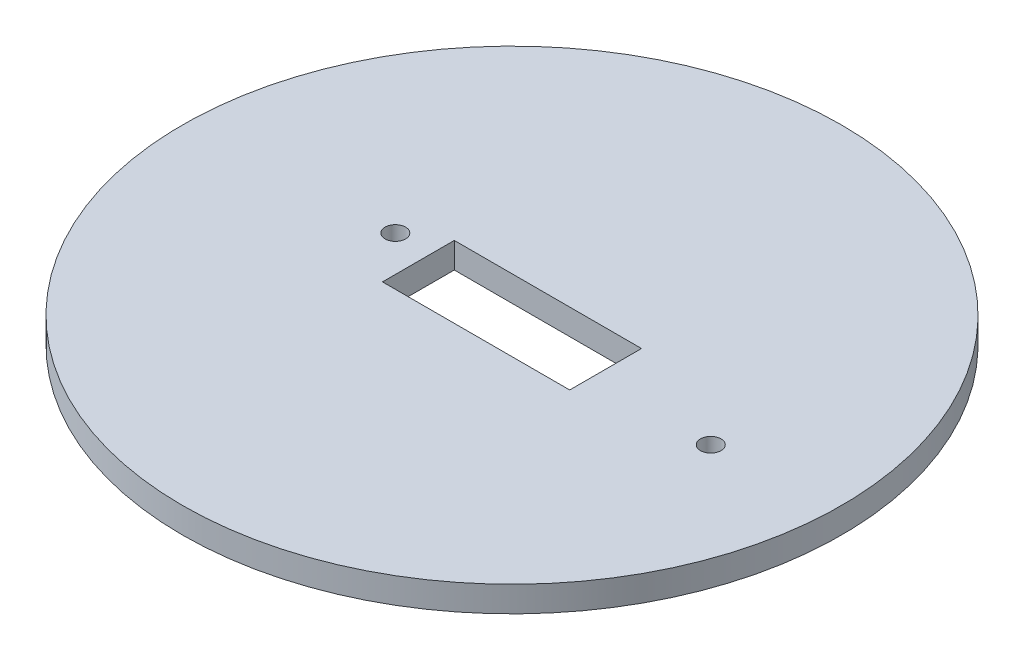
ISO-10303-21;
HEADER;
FILE_DESCRIPTION(('STEP AP214'),'2;1');
FILE_NAME('part.step','',(''),(''),'','','');
FILE_SCHEMA(('AUTOMOTIVE_DESIGN { 1 0 10303 214 1 1 1 1 }'));
ENDSEC;
DATA;
#1=APPLICATION_CONTEXT('core data for automotive mechanical design processes');
#2=APPLICATION_PROTOCOL_DEFINITION('international standard','automotive_design',2000,#1);
#3=PRODUCT_CONTEXT('',#1,'mechanical');
#4=PRODUCT('Part','Part','',(#3));
#5=PRODUCT_RELATED_PRODUCT_CATEGORY('part','',(#4));
#6=PRODUCT_DEFINITION_FORMATION('','',#4);
#7=PRODUCT_DEFINITION_CONTEXT('part definition',#1,'design');
#8=PRODUCT_DEFINITION('design','',#6,#7);
#9=PRODUCT_DEFINITION_SHAPE('','',#8);
#10=(LENGTH_UNIT() NAMED_UNIT(*) SI_UNIT(.MILLI.,.METRE.));
#11=(NAMED_UNIT(*) PLANE_ANGLE_UNIT() SI_UNIT($,.RADIAN.));
#12=(NAMED_UNIT(*) SI_UNIT($,.STERADIAN.) SOLID_ANGLE_UNIT());
#13=UNCERTAINTY_MEASURE_WITH_UNIT(LENGTH_MEASURE(1.E-05),#10,'distance_accuracy_value','');
#14=(GEOMETRIC_REPRESENTATION_CONTEXT(3) GLOBAL_UNCERTAINTY_ASSIGNED_CONTEXT((#13)) GLOBAL_UNIT_ASSIGNED_CONTEXT((#10,
#11,#12)) REPRESENTATION_CONTEXT('',''));
#15=CARTESIAN_POINT('',(0.,0.,0.));
#16=DIRECTION('',(0.,0.,1.));
#17=DIRECTION('',(1.,0.,0.));
#18=AXIS2_PLACEMENT_3D('',#15,#16,#17);
#19=CARTESIAN_POINT('',(0.,2.,0.));
#20=DIRECTION('',(0.,-1.,0.));
#21=DIRECTION('',(0.,0.,-1.));
#22=AXIS2_PLACEMENT_3D('',#19,#20,#21);
#23=CYLINDRICAL_SURFACE('',#22,25.7);
#24=CARTESIAN_POINT('',(0.,2.,0.));
#25=DIRECTION('',(0.,1.,0.));
#26=DIRECTION('',(0.,0.,1.));
#27=AXIS2_PLACEMENT_3D('',#24,#25,#26);
#28=CIRCLE('',#27,25.7);
#29=CARTESIAN_POINT('',(0.,2.,25.7));
#30=VERTEX_POINT('',#29);
#31=EDGE_CURVE('E11',#30,#30,#28,.T.);
#32=ORIENTED_EDGE('',*,*,#31,.F.);
#33=EDGE_LOOP('',(#32));
#34=FACE_BOUND('',#33,.T.);
#35=CARTESIAN_POINT('',(0.,0.,0.));
#36=DIRECTION('',(0.,1.,0.));
#37=DIRECTION('',(0.,0.,1.));
#38=AXIS2_PLACEMENT_3D('',#35,#36,#37);
#39=CIRCLE('',#38,25.7);
#40=CARTESIAN_POINT('',(0.,0.,25.7));
#41=VERTEX_POINT('',#40);
#42=EDGE_CURVE('E40',#41,#41,#39,.T.);
#43=ORIENTED_EDGE('',*,*,#42,.T.);
#44=EDGE_LOOP('',(#43));
#45=FACE_BOUND('',#44,.T.);
#46=ADVANCED_FACE('F37',(#34,#45),#23,.T.);
#47=CARTESIAN_POINT('',(0.,2.,0.));
#48=DIRECTION('',(0.,1.,0.));
#49=DIRECTION('',(0.,0.,1.));
#50=AXIS2_PLACEMENT_3D('',#47,#48,#49);
#51=PLANE('',#50);
#52=CARTESIAN_POINT('',(-10.1,2.,-0.999999999999999));
#53=DIRECTION('',(0.,1.,0.));
#54=DIRECTION('',(0.,0.,1.));
#55=AXIS2_PLACEMENT_3D('',#52,#53,#54);
#56=CIRCLE('',#55,0.8);
#57=CARTESIAN_POINT('',(-10.1,2.,-0.199999999999999));
#58=VERTEX_POINT('',#57);
#59=EDGE_CURVE('E170',#58,#58,#56,.T.);
#60=ORIENTED_EDGE('',*,*,#59,.F.);
#61=EDGE_LOOP('',(#60));
#62=FACE_BOUND('',#61,.T.);
#63=CARTESIAN_POINT('',(16.5,2.,1.));
#64=DIRECTION('',(0.,1.,0.));
#65=DIRECTION('',(0.,0.,1.));
#66=AXIS2_PLACEMENT_3D('',#63,#64,#65);
#67=CIRCLE('',#66,0.799999999999999);
#68=CARTESIAN_POINT('',(16.5,2.,1.8));
#69=VERTEX_POINT('',#68);
#70=EDGE_CURVE('E167',#69,#69,#67,.T.);
#71=ORIENTED_EDGE('',*,*,#70,.F.);
#72=EDGE_LOOP('',(#71));
#73=FACE_BOUND('',#72,.T.);
#74=DIRECTION('',(0.,0.,-1.));
#75=VECTOR('',#74,1.);
#76=CARTESIAN_POINT('',(7.3,2.,2.8));
#77=LINE('',#76,#75);
#78=CARTESIAN_POINT('',(7.3,2.,2.8));
#79=VERTEX_POINT('',#78);
#80=CARTESIAN_POINT('',(7.3,2.,-2.8));
#81=VERTEX_POINT('',#80);
#82=EDGE_CURVE('E51',#79,#81,#77,.T.);
#83=ORIENTED_EDGE('',*,*,#82,.F.);
#84=DIRECTION('',(1.,0.,0.));
#85=VECTOR('',#84,1.);
#86=CARTESIAN_POINT('',(-7.3,2.,2.8));
#87=LINE('',#86,#85);
#88=CARTESIAN_POINT('',(-7.3,2.,2.8));
#89=VERTEX_POINT('',#88);
#90=EDGE_CURVE('E95',#89,#79,#87,.T.);
#91=ORIENTED_EDGE('',*,*,#90,.F.);
#92=DIRECTION('',(0.,0.,1.));
#93=VECTOR('',#92,1.);
#94=CARTESIAN_POINT('',(-7.3,2.,2.8));
#95=LINE('',#94,#93);
#96=CARTESIAN_POINT('',(-7.3,2.,-2.8));
#97=VERTEX_POINT('',#96);
#98=EDGE_CURVE('E98',#97,#89,#95,.T.);
#99=ORIENTED_EDGE('',*,*,#98,.F.);
#100=DIRECTION('',(-1.,0.,0.));
#101=VECTOR('',#100,1.);
#102=CARTESIAN_POINT('',(-7.3,2.,-2.8));
#103=LINE('',#102,#101);
#104=EDGE_CURVE('E107',#81,#97,#103,.T.);
#105=ORIENTED_EDGE('',*,*,#104,.F.);
#106=EDGE_LOOP('',(#83,#91,#99,#105));
#107=FACE_BOUND('',#106,.T.);
#108=ORIENTED_EDGE('',*,*,#31,.T.);
#109=EDGE_LOOP('',(#108));
#110=FACE_BOUND('',#109,.T.);
#111=ADVANCED_FACE('F119',(#62,#73,#107,#110),#51,.T.);
#112=CARTESIAN_POINT('',(0.,0.,0.));
#113=DIRECTION('',(0.,1.,0.));
#114=DIRECTION('',(0.,0.,1.));
#115=AXIS2_PLACEMENT_3D('',#112,#113,#114);
#116=PLANE('',#115);
#117=CARTESIAN_POINT('',(-10.1,0.,-0.999999999999999));
#118=DIRECTION('',(0.,1.,0.));
#119=DIRECTION('',(0.,0.,1.));
#120=AXIS2_PLACEMENT_3D('',#117,#118,#119);
#121=CIRCLE('',#120,0.8);
#122=CARTESIAN_POINT('',(-10.1,0.,-0.199999999999999));
#123=VERTEX_POINT('',#122);
#124=EDGE_CURVE('E169',#123,#123,#121,.T.);
#125=ORIENTED_EDGE('',*,*,#124,.T.);
#126=EDGE_LOOP('',(#125));
#127=FACE_BOUND('',#126,.T.);
#128=CARTESIAN_POINT('',(16.5,0.,1.));
#129=DIRECTION('',(0.,1.,0.));
#130=DIRECTION('',(0.,0.,1.));
#131=AXIS2_PLACEMENT_3D('',#128,#129,#130);
#132=CIRCLE('',#131,0.799999999999999);
#133=CARTESIAN_POINT('',(16.5,0.,1.8));
#134=VERTEX_POINT('',#133);
#135=EDGE_CURVE('E101',#134,#134,#132,.T.);
#136=ORIENTED_EDGE('',*,*,#135,.T.);
#137=EDGE_LOOP('',(#136));
#138=FACE_BOUND('',#137,.T.);
#139=DIRECTION('',(1.,0.,0.));
#140=VECTOR('',#139,1.);
#141=CARTESIAN_POINT('',(-7.3,0.,2.8));
#142=LINE('',#141,#140);
#143=CARTESIAN_POINT('',(-7.3,0.,2.8));
#144=VERTEX_POINT('',#143);
#145=CARTESIAN_POINT('',(7.3,0.,2.8));
#146=VERTEX_POINT('',#145);
#147=EDGE_CURVE('E85',#144,#146,#142,.T.);
#148=ORIENTED_EDGE('',*,*,#147,.T.);
#149=DIRECTION('',(0.,0.,-1.));
#150=VECTOR('',#149,1.);
#151=CARTESIAN_POINT('',(7.3,0.,2.8));
#152=LINE('',#151,#150);
#153=CARTESIAN_POINT('',(7.3,0.,-2.8));
#154=VERTEX_POINT('',#153);
#155=EDGE_CURVE('E79',#146,#154,#152,.T.);
#156=ORIENTED_EDGE('',*,*,#155,.T.);
#157=DIRECTION('',(-1.,0.,0.));
#158=VECTOR('',#157,1.);
#159=CARTESIAN_POINT('',(-7.3,0.,-2.8));
#160=LINE('',#159,#158);
#161=CARTESIAN_POINT('',(-7.3,0.,-2.8));
#162=VERTEX_POINT('',#161);
#163=EDGE_CURVE('E88',#154,#162,#160,.T.);
#164=ORIENTED_EDGE('',*,*,#163,.T.);
#165=DIRECTION('',(0.,0.,1.));
#166=VECTOR('',#165,1.);
#167=CARTESIAN_POINT('',(-7.3,0.,2.8));
#168=LINE('',#167,#166);
#169=EDGE_CURVE('E59',#162,#144,#168,.T.);
#170=ORIENTED_EDGE('',*,*,#169,.T.);
#171=EDGE_LOOP('',(#148,#156,#164,#170));
#172=FACE_BOUND('',#171,.T.);
#173=ORIENTED_EDGE('',*,*,#42,.F.);
#174=EDGE_LOOP('',(#173));
#175=FACE_BOUND('',#174,.T.);
#176=ADVANCED_FACE('F92',(#127,#138,#172,#175),#116,.F.);
#177=CARTESIAN_POINT('',(7.3,0.,2.8));
#178=DIRECTION('',(1.,0.,0.));
#179=DIRECTION('',(0.,0.,-1.));
#180=AXIS2_PLACEMENT_3D('',#177,#178,#179);
#181=PLANE('',#180);
#182=ORIENTED_EDGE('',*,*,#82,.T.);
#183=DIRECTION('',(0.,1.,0.));
#184=VECTOR('',#183,1.);
#185=CARTESIAN_POINT('',(7.3,0.,-2.8));
#186=LINE('',#185,#184);
#187=EDGE_CURVE('E75',#154,#81,#186,.T.);
#188=ORIENTED_EDGE('',*,*,#187,.F.);
#189=ORIENTED_EDGE('',*,*,#155,.F.);
#190=DIRECTION('',(0.,1.,0.));
#191=VECTOR('',#190,1.);
#192=CARTESIAN_POINT('',(7.3,0.,2.8));
#193=LINE('',#192,#191);
#194=EDGE_CURVE('E111',#146,#79,#193,.T.);
#195=ORIENTED_EDGE('',*,*,#194,.T.);
#196=EDGE_LOOP('',(#182,#188,#189,#195));
#197=FACE_BOUND('',#196,.T.);
#198=ADVANCED_FACE('F77',(#197),#181,.F.);
#199=CARTESIAN_POINT('',(-7.3,0.,2.8));
#200=DIRECTION('',(0.,0.,1.));
#201=DIRECTION('',(1.,0.,0.));
#202=AXIS2_PLACEMENT_3D('',#199,#200,#201);
#203=PLANE('',#202);
#204=ORIENTED_EDGE('',*,*,#90,.T.);
#205=ORIENTED_EDGE('',*,*,#194,.F.);
#206=ORIENTED_EDGE('',*,*,#147,.F.);
#207=DIRECTION('',(0.,1.,0.));
#208=VECTOR('',#207,1.);
#209=CARTESIAN_POINT('',(-7.3,0.,2.8));
#210=LINE('',#209,#208);
#211=EDGE_CURVE('E113',#144,#89,#210,.T.);
#212=ORIENTED_EDGE('',*,*,#211,.T.);
#213=EDGE_LOOP('',(#204,#205,#206,#212));
#214=FACE_BOUND('',#213,.T.);
#215=ADVANCED_FACE('F122',(#214),#203,.F.);
#216=CARTESIAN_POINT('',(-7.3,0.,2.8));
#217=DIRECTION('',(-1.,0.,0.));
#218=DIRECTION('',(0.,0.,1.));
#219=AXIS2_PLACEMENT_3D('',#216,#217,#218);
#220=PLANE('',#219);
#221=ORIENTED_EDGE('',*,*,#98,.T.);
#222=ORIENTED_EDGE('',*,*,#211,.F.);
#223=ORIENTED_EDGE('',*,*,#169,.F.);
#224=DIRECTION('',(0.,1.,0.));
#225=VECTOR('',#224,1.);
#226=CARTESIAN_POINT('',(-7.3,0.,-2.8));
#227=LINE('',#226,#225);
#228=EDGE_CURVE('E84',#162,#97,#227,.T.);
#229=ORIENTED_EDGE('',*,*,#228,.T.);
#230=EDGE_LOOP('',(#221,#222,#223,#229));
#231=FACE_BOUND('',#230,.T.);
#232=ADVANCED_FACE('F115',(#231),#220,.F.);
#233=CARTESIAN_POINT('',(-7.3,0.,-2.8));
#234=DIRECTION('',(0.,0.,-1.));
#235=DIRECTION('',(-1.,0.,0.));
#236=AXIS2_PLACEMENT_3D('',#233,#234,#235);
#237=PLANE('',#236);
#238=ORIENTED_EDGE('',*,*,#104,.T.);
#239=ORIENTED_EDGE('',*,*,#228,.F.);
#240=ORIENTED_EDGE('',*,*,#163,.F.);
#241=ORIENTED_EDGE('',*,*,#187,.T.);
#242=EDGE_LOOP('',(#238,#239,#240,#241));
#243=FACE_BOUND('',#242,.T.);
#244=ADVANCED_FACE('F89',(#243),#237,.F.);
#245=CARTESIAN_POINT('',(16.5,2.,1.));
#246=DIRECTION('',(0.,1.,0.));
#247=DIRECTION('',(0.,0.,1.));
#248=AXIS2_PLACEMENT_3D('',#245,#246,#247);
#249=CYLINDRICAL_SURFACE('',#248,0.799999999999999);
#250=ORIENTED_EDGE('',*,*,#135,.F.);
#251=EDGE_LOOP('',(#250));
#252=FACE_BOUND('',#251,.T.);
#253=ORIENTED_EDGE('',*,*,#70,.T.);
#254=EDGE_LOOP('',(#253));
#255=FACE_BOUND('',#254,.T.);
#256=ADVANCED_FACE('F151',(#252,#255),#249,.F.);
#257=CARTESIAN_POINT('',(-10.1,2.,-0.999999999999999));
#258=DIRECTION('',(0.,1.,0.));
#259=DIRECTION('',(0.,0.,1.));
#260=AXIS2_PLACEMENT_3D('',#257,#258,#259);
#261=CYLINDRICAL_SURFACE('',#260,0.8);
#262=ORIENTED_EDGE('',*,*,#124,.F.);
#263=EDGE_LOOP('',(#262));
#264=FACE_BOUND('',#263,.T.);
#265=ORIENTED_EDGE('',*,*,#59,.T.);
#266=EDGE_LOOP('',(#265));
#267=FACE_BOUND('',#266,.T.);
#268=ADVANCED_FACE('F155',(#264,#267),#261,.F.);
#269=CLOSED_SHELL('',(#46,#111,#176,#198,#215,#232,#244,#256,#268));
#270=MANIFOLD_SOLID_BREP('B2',#269);
#271=ADVANCED_BREP_SHAPE_REPRESENTATION('',(#18,#270),#14);
#272=SHAPE_DEFINITION_REPRESENTATION(#9,#271);
ENDSEC;
END-ISO-10303-21;
